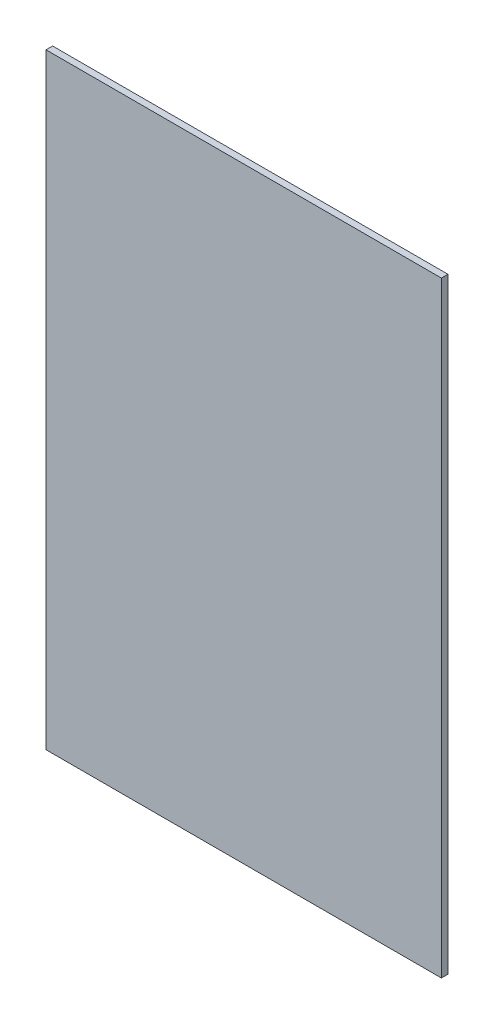
ISO-10303-21;
HEADER;
FILE_DESCRIPTION(('STEP AP214'),'2;1');
FILE_NAME('part.step','',(''),(''),'','','');
FILE_SCHEMA(('AUTOMOTIVE_DESIGN { 1 0 10303 214 1 1 1 1 }'));
ENDSEC;
DATA;
#1=APPLICATION_CONTEXT('core data for automotive mechanical design processes');
#2=APPLICATION_PROTOCOL_DEFINITION('international standard','automotive_design',2000,#1);
#3=PRODUCT_CONTEXT('',#1,'mechanical');
#4=PRODUCT('Part','Part','',(#3));
#5=PRODUCT_RELATED_PRODUCT_CATEGORY('part','',(#4));
#6=PRODUCT_DEFINITION_FORMATION('','',#4);
#7=PRODUCT_DEFINITION_CONTEXT('part definition',#1,'design');
#8=PRODUCT_DEFINITION('design','',#6,#7);
#9=PRODUCT_DEFINITION_SHAPE('','',#8);
#10=(LENGTH_UNIT() NAMED_UNIT(*) SI_UNIT(.MILLI.,.METRE.));
#11=(NAMED_UNIT(*) PLANE_ANGLE_UNIT() SI_UNIT($,.RADIAN.));
#12=(NAMED_UNIT(*) SI_UNIT($,.STERADIAN.) SOLID_ANGLE_UNIT());
#13=UNCERTAINTY_MEASURE_WITH_UNIT(LENGTH_MEASURE(1.E-05),#10,'distance_accuracy_value','');
#14=(GEOMETRIC_REPRESENTATION_CONTEXT(3) GLOBAL_UNCERTAINTY_ASSIGNED_CONTEXT((#13)) GLOBAL_UNIT_ASSIGNED_CONTEXT((#10,
#11,#12)) REPRESENTATION_CONTEXT('',''));
#15=CARTESIAN_POINT('',(0.,0.,0.));
#16=DIRECTION('',(0.,0.,1.));
#17=DIRECTION('',(1.,0.,0.));
#18=AXIS2_PLACEMENT_3D('',#15,#16,#17);
#19=CARTESIAN_POINT('',(300.,460.,10.));
#20=DIRECTION('',(-1.,0.,0.));
#21=DIRECTION('',(0.,-1.,0.));
#22=AXIS2_PLACEMENT_3D('',#19,#20,#21);
#23=PLANE('',#22);
#24=DIRECTION('',(0.,1.,0.));
#25=VECTOR('',#24,1.);
#26=CARTESIAN_POINT('',(300.,460.,0.));
#27=LINE('',#26,#25);
#28=CARTESIAN_POINT('',(300.,-460.,0.));
#29=VERTEX_POINT('',#28);
#30=CARTESIAN_POINT('',(300.,460.,0.));
#31=VERTEX_POINT('',#30);
#32=EDGE_CURVE('E105',#29,#31,#27,.T.);
#33=ORIENTED_EDGE('',*,*,#32,.T.);
#34=DIRECTION('',(0.,0.,-1.));
#35=VECTOR('',#34,1.);
#36=CARTESIAN_POINT('',(300.,460.,10.));
#37=LINE('',#36,#35);
#38=CARTESIAN_POINT('',(300.,460.,10.));
#39=VERTEX_POINT('',#38);
#40=EDGE_CURVE('E11',#39,#31,#37,.T.);
#41=ORIENTED_EDGE('',*,*,#40,.F.);
#42=DIRECTION('',(0.,1.,0.));
#43=VECTOR('',#42,1.);
#44=CARTESIAN_POINT('',(300.,460.,10.));
#45=LINE('',#44,#43);
#46=CARTESIAN_POINT('',(300.,-460.,10.));
#47=VERTEX_POINT('',#46);
#48=EDGE_CURVE('E89',#47,#39,#45,.T.);
#49=ORIENTED_EDGE('',*,*,#48,.F.);
#50=DIRECTION('',(0.,0.,-1.));
#51=VECTOR('',#50,1.);
#52=CARTESIAN_POINT('',(300.,-460.,10.));
#53=LINE('',#52,#51);
#54=EDGE_CURVE('E97',#47,#29,#53,.T.);
#55=ORIENTED_EDGE('',*,*,#54,.T.);
#56=EDGE_LOOP('',(#33,#41,#49,#55));
#57=FACE_BOUND('',#56,.T.);
#58=ADVANCED_FACE('F39',(#57),#23,.F.);
#59=CARTESIAN_POINT('',(-300.,460.,10.));
#60=DIRECTION('',(0.,-1.,0.));
#61=DIRECTION('',(1.,0.,0.));
#62=AXIS2_PLACEMENT_3D('',#59,#60,#61);
#63=PLANE('',#62);
#64=DIRECTION('',(-1.,0.,0.));
#65=VECTOR('',#64,1.);
#66=CARTESIAN_POINT('',(-300.,460.,0.));
#67=LINE('',#66,#65);
#68=CARTESIAN_POINT('',(-300.,460.,0.));
#69=VERTEX_POINT('',#68);
#70=EDGE_CURVE('E92',#31,#69,#67,.T.);
#71=ORIENTED_EDGE('',*,*,#70,.T.);
#72=DIRECTION('',(0.,0.,-1.));
#73=VECTOR('',#72,1.);
#74=CARTESIAN_POINT('',(-300.,460.,10.));
#75=LINE('',#74,#73);
#76=CARTESIAN_POINT('',(-300.,460.,10.));
#77=VERTEX_POINT('',#76);
#78=EDGE_CURVE('E50',#77,#69,#75,.T.);
#79=ORIENTED_EDGE('',*,*,#78,.F.);
#80=DIRECTION('',(-1.,0.,0.));
#81=VECTOR('',#80,1.);
#82=CARTESIAN_POINT('',(-300.,460.,10.));
#83=LINE('',#82,#81);
#84=EDGE_CURVE('E82',#39,#77,#83,.T.);
#85=ORIENTED_EDGE('',*,*,#84,.F.);
#86=ORIENTED_EDGE('',*,*,#40,.T.);
#87=EDGE_LOOP('',(#71,#79,#85,#86));
#88=FACE_BOUND('',#87,.T.);
#89=ADVANCED_FACE('F93',(#88),#63,.F.);
#90=CARTESIAN_POINT('',(-300.,460.,10.));
#91=DIRECTION('',(1.,0.,0.));
#92=DIRECTION('',(0.,1.,0.));
#93=AXIS2_PLACEMENT_3D('',#90,#91,#92);
#94=PLANE('',#93);
#95=DIRECTION('',(0.,-1.,0.));
#96=VECTOR('',#95,1.);
#97=CARTESIAN_POINT('',(-300.,460.,0.));
#98=LINE('',#97,#96);
#99=CARTESIAN_POINT('',(-300.,-460.,0.));
#100=VERTEX_POINT('',#99);
#101=EDGE_CURVE('E72',#69,#100,#98,.T.);
#102=ORIENTED_EDGE('',*,*,#101,.T.);
#103=DIRECTION('',(0.,0.,-1.));
#104=VECTOR('',#103,1.);
#105=CARTESIAN_POINT('',(-300.,-460.,10.));
#106=LINE('',#105,#104);
#107=CARTESIAN_POINT('',(-300.,-460.,10.));
#108=VERTEX_POINT('',#107);
#109=EDGE_CURVE('E94',#108,#100,#106,.T.);
#110=ORIENTED_EDGE('',*,*,#109,.F.);
#111=DIRECTION('',(0.,-1.,0.));
#112=VECTOR('',#111,1.);
#113=CARTESIAN_POINT('',(-300.,460.,10.));
#114=LINE('',#113,#112);
#115=EDGE_CURVE('E88',#77,#108,#114,.T.);
#116=ORIENTED_EDGE('',*,*,#115,.F.);
#117=ORIENTED_EDGE('',*,*,#78,.T.);
#118=EDGE_LOOP('',(#102,#110,#116,#117));
#119=FACE_BOUND('',#118,.T.);
#120=ADVANCED_FACE('F96',(#119),#94,.F.);
#121=CARTESIAN_POINT('',(-300.,-460.,10.));
#122=DIRECTION('',(0.,1.,0.));
#123=DIRECTION('',(0.,0.,1.));
#124=AXIS2_PLACEMENT_3D('',#121,#122,#123);
#125=PLANE('',#124);
#126=DIRECTION('',(1.,0.,0.));
#127=VECTOR('',#126,1.);
#128=CARTESIAN_POINT('',(-300.,-460.,0.));
#129=LINE('',#128,#127);
#130=EDGE_CURVE('E76',#100,#29,#129,.T.);
#131=ORIENTED_EDGE('',*,*,#130,.T.);
#132=ORIENTED_EDGE('',*,*,#54,.F.);
#133=DIRECTION('',(1.,0.,0.));
#134=VECTOR('',#133,1.);
#135=CARTESIAN_POINT('',(-300.,-460.,10.));
#136=LINE('',#135,#134);
#137=EDGE_CURVE('E54',#108,#47,#136,.T.);
#138=ORIENTED_EDGE('',*,*,#137,.F.);
#139=ORIENTED_EDGE('',*,*,#109,.T.);
#140=EDGE_LOOP('',(#131,#132,#138,#139));
#141=FACE_BOUND('',#140,.T.);
#142=ADVANCED_FACE('F108',(#141),#125,.F.);
#143=CARTESIAN_POINT('',(0.,0.,10.));
#144=DIRECTION('',(0.,0.,1.));
#145=DIRECTION('',(1.,0.,0.));
#146=AXIS2_PLACEMENT_3D('',#143,#144,#145);
#147=PLANE('',#146);
#148=ORIENTED_EDGE('',*,*,#48,.T.);
#149=ORIENTED_EDGE('',*,*,#84,.T.);
#150=ORIENTED_EDGE('',*,*,#115,.T.);
#151=ORIENTED_EDGE('',*,*,#137,.T.);
#152=EDGE_LOOP('',(#148,#149,#150,#151));
#153=FACE_BOUND('',#152,.T.);
#154=ADVANCED_FACE('F86',(#153),#147,.T.);
#155=CARTESIAN_POINT('',(0.,0.,0.));
#156=DIRECTION('',(0.,0.,1.));
#157=DIRECTION('',(1.,0.,0.));
#158=AXIS2_PLACEMENT_3D('',#155,#156,#157);
#159=PLANE('',#158);
#160=ORIENTED_EDGE('',*,*,#32,.F.);
#161=ORIENTED_EDGE('',*,*,#130,.F.);
#162=ORIENTED_EDGE('',*,*,#101,.F.);
#163=ORIENTED_EDGE('',*,*,#70,.F.);
#164=EDGE_LOOP('',(#160,#161,#162,#163));
#165=FACE_BOUND('',#164,.T.);
#166=ADVANCED_FACE('F115',(#165),#159,.F.);
#167=CLOSED_SHELL('',(#58,#89,#120,#142,#154,#166));
#168=MANIFOLD_SOLID_BREP('B2',#167);
#169=ADVANCED_BREP_SHAPE_REPRESENTATION('',(#18,#168),#14);
#170=SHAPE_DEFINITION_REPRESENTATION(#9,#169);
ENDSEC;
END-ISO-10303-21;
